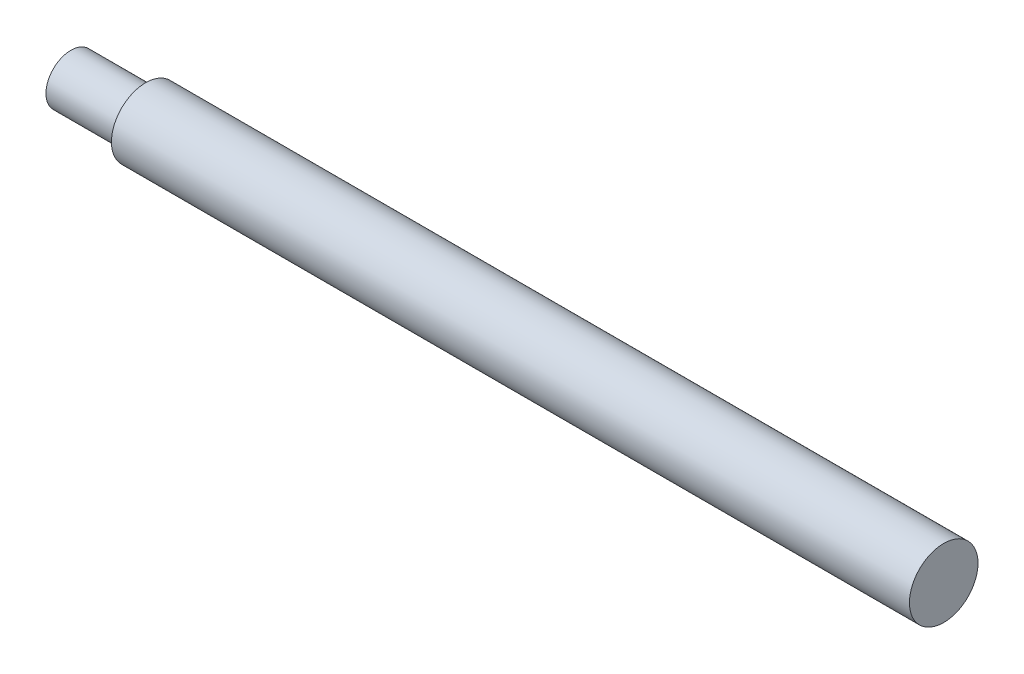
ISO-10303-21;
HEADER;
FILE_DESCRIPTION(('STEP AP214'),'2;1');
FILE_NAME('part.step','',(''),(''),'','','');
FILE_SCHEMA(('AUTOMOTIVE_DESIGN { 1 0 10303 214 1 1 1 1 }'));
ENDSEC;
DATA;
#1=APPLICATION_CONTEXT('core data for automotive mechanical design processes');
#2=APPLICATION_PROTOCOL_DEFINITION('international standard','automotive_design',2000,#1);
#3=PRODUCT_CONTEXT('',#1,'mechanical');
#4=PRODUCT('Part','Part','',(#3));
#5=PRODUCT_RELATED_PRODUCT_CATEGORY('part','',(#4));
#6=PRODUCT_DEFINITION_FORMATION('','',#4);
#7=PRODUCT_DEFINITION_CONTEXT('part definition',#1,'design');
#8=PRODUCT_DEFINITION('design','',#6,#7);
#9=PRODUCT_DEFINITION_SHAPE('','',#8);
#10=(LENGTH_UNIT() NAMED_UNIT(*) SI_UNIT(.MILLI.,.METRE.));
#11=(NAMED_UNIT(*) PLANE_ANGLE_UNIT() SI_UNIT($,.RADIAN.));
#12=(NAMED_UNIT(*) SI_UNIT($,.STERADIAN.) SOLID_ANGLE_UNIT());
#13=UNCERTAINTY_MEASURE_WITH_UNIT(LENGTH_MEASURE(1.E-05),#10,'distance_accuracy_value','');
#14=(GEOMETRIC_REPRESENTATION_CONTEXT(3) GLOBAL_UNCERTAINTY_ASSIGNED_CONTEXT((#13)) GLOBAL_UNIT_ASSIGNED_CONTEXT((#10,
#11,#12)) REPRESENTATION_CONTEXT('',''));
#15=CARTESIAN_POINT('',(0.,0.,0.));
#16=DIRECTION('',(0.,0.,1.));
#17=DIRECTION('',(1.,0.,0.));
#18=AXIS2_PLACEMENT_3D('',#15,#16,#17);
#19=CARTESIAN_POINT('',(-406.4,0.,0.));
#20=DIRECTION('',(1.,0.,0.));
#21=DIRECTION('',(0.,0.,-1.));
#22=AXIS2_PLACEMENT_3D('',#19,#20,#21);
#23=PLANE('',#22);
#24=CARTESIAN_POINT('',(-406.4,0.,0.));
#25=DIRECTION('',(1.,0.,0.));
#26=DIRECTION('',(0.,0.,-1.));
#27=AXIS2_PLACEMENT_3D('',#24,#25,#26);
#28=CIRCLE('',#27,17.4625);
#29=CARTESIAN_POINT('',(-406.4,0.,-17.4625));
#30=VERTEX_POINT('',#29);
#31=EDGE_CURVE('E37',#30,#30,#28,.T.);
#32=ORIENTED_EDGE('',*,*,#31,.F.);
#33=EDGE_LOOP('',(#32));
#34=FACE_BOUND('',#33,.T.);
#35=CARTESIAN_POINT('',(-406.4,0.,0.));
#36=DIRECTION('',(1.,0.,0.));
#37=DIRECTION('',(0.,0.,-1.));
#38=AXIS2_PLACEMENT_3D('',#35,#36,#37);
#39=CIRCLE('',#38,12.7);
#40=CARTESIAN_POINT('',(-406.4,0.,-12.7));
#41=VERTEX_POINT('',#40);
#42=EDGE_CURVE('E10',#41,#41,#39,.F.);
#43=ORIENTED_EDGE('',*,*,#42,.F.);
#44=EDGE_LOOP('',(#43));
#45=FACE_BOUND('',#44,.T.);
#46=ADVANCED_FACE('F30',(#34,#45),#23,.F.);
#47=CARTESIAN_POINT('',(-406.4,0.,0.));
#48=DIRECTION('',(1.,0.,0.));
#49=DIRECTION('',(0.,0.,-1.));
#50=AXIS2_PLACEMENT_3D('',#47,#48,#49);
#51=CYLINDRICAL_SURFACE('',#50,17.4625);
#52=ORIENTED_EDGE('',*,*,#31,.T.);
#53=EDGE_LOOP('',(#52));
#54=FACE_BOUND('',#53,.T.);
#55=CARTESIAN_POINT('',(0.,0.,0.));
#56=DIRECTION('',(1.,0.,0.));
#57=DIRECTION('',(0.,0.,-1.));
#58=AXIS2_PLACEMENT_3D('',#55,#56,#57);
#59=CIRCLE('',#58,17.4625);
#60=CARTESIAN_POINT('',(0.,0.,-17.4625));
#61=VERTEX_POINT('',#60);
#62=EDGE_CURVE('E41',#61,#61,#59,.T.);
#63=ORIENTED_EDGE('',*,*,#62,.F.);
#64=EDGE_LOOP('',(#63));
#65=FACE_BOUND('',#64,.T.);
#66=ADVANCED_FACE('F32',(#54,#65),#51,.T.);
#67=CARTESIAN_POINT('',(0.,0.,0.));
#68=DIRECTION('',(1.,0.,0.));
#69=DIRECTION('',(0.,0.,-1.));
#70=AXIS2_PLACEMENT_3D('',#67,#68,#69);
#71=PLANE('',#70);
#72=ORIENTED_EDGE('',*,*,#62,.T.);
#73=EDGE_LOOP('',(#72));
#74=FACE_BOUND('',#73,.T.);
#75=ADVANCED_FACE('F55',(#74),#71,.T.);
#76=CARTESIAN_POINT('',(-444.5,0.,0.));
#77=DIRECTION('',(1.,0.,0.));
#78=DIRECTION('',(0.,0.,-1.));
#79=AXIS2_PLACEMENT_3D('',#76,#77,#78);
#80=CYLINDRICAL_SURFACE('',#79,12.7);
#81=CARTESIAN_POINT('',(-444.5,0.,0.));
#82=DIRECTION('',(-1.,0.,0.));
#83=DIRECTION('',(0.,0.,1.));
#84=AXIS2_PLACEMENT_3D('',#81,#82,#83);
#85=CIRCLE('',#84,12.7);
#86=CARTESIAN_POINT('',(-444.5,0.,-12.7));
#87=VERTEX_POINT('',#86);
#88=EDGE_CURVE('E46',#87,#87,#85,.T.);
#89=CARTESIAN_POINT('',(-444.5,0.,-12.7));
#90=CARTESIAN_POINT('',(-444.103125,0.,-12.7));
#91=CARTESIAN_POINT('',(-443.70625,0.,-12.7));
#92=CARTESIAN_POINT('',(-442.9125,0.,-12.7));
#93=CARTESIAN_POINT('',(-442.515625,0.,-12.7));
#94=CARTESIAN_POINT('',(-441.721875,0.,-12.7));
#95=CARTESIAN_POINT('',(-441.325,0.,-12.7));
#96=CARTESIAN_POINT('',(-440.53125,0.,-12.7));
#97=CARTESIAN_POINT('',(-440.134375,0.,-12.7));
#98=CARTESIAN_POINT('',(-439.340625,0.,-12.7));
#99=CARTESIAN_POINT('',(-438.94375,0.,-12.7));
#100=CARTESIAN_POINT('',(-438.15,0.,-12.7));
#101=CARTESIAN_POINT('',(-437.753125,0.,-12.7));
#102=CARTESIAN_POINT('',(-436.959375,0.,-12.7));
#103=CARTESIAN_POINT('',(-436.5625,0.,-12.7));
#104=CARTESIAN_POINT('',(-435.76875,0.,-12.7));
#105=CARTESIAN_POINT('',(-435.371875,0.,-12.7));
#106=CARTESIAN_POINT('',(-434.578125,0.,-12.7));
#107=CARTESIAN_POINT('',(-434.18125,0.,-12.7));
#108=CARTESIAN_POINT('',(-433.3875,0.,-12.7));
#109=CARTESIAN_POINT('',(-432.990625,0.,-12.7));
#110=CARTESIAN_POINT('',(-432.196875,0.,-12.7));
#111=CARTESIAN_POINT('',(-431.8,0.,-12.7));
#112=CARTESIAN_POINT('',(-431.00625,0.,-12.7));
#113=CARTESIAN_POINT('',(-430.609375,0.,-12.7));
#114=CARTESIAN_POINT('',(-429.815625,0.,-12.7));
#115=CARTESIAN_POINT('',(-429.41875,0.,-12.7));
#116=CARTESIAN_POINT('',(-428.625,0.,-12.7));
#117=CARTESIAN_POINT('',(-428.228125,0.,-12.7));
#118=CARTESIAN_POINT('',(-427.434375,0.,-12.7));
#119=CARTESIAN_POINT('',(-427.0375,0.,-12.7));
#120=CARTESIAN_POINT('',(-426.24375,0.,-12.7));
#121=CARTESIAN_POINT('',(-425.846875,0.,-12.7));
#122=CARTESIAN_POINT('',(-425.053125,0.,-12.7));
#123=CARTESIAN_POINT('',(-424.65625,0.,-12.7));
#124=CARTESIAN_POINT('',(-423.8625,0.,-12.7));
#125=CARTESIAN_POINT('',(-423.465625,0.,-12.7));
#126=CARTESIAN_POINT('',(-422.671875,0.,-12.7));
#127=CARTESIAN_POINT('',(-422.275,0.,-12.7));
#128=CARTESIAN_POINT('',(-421.48125,0.,-12.7));
#129=CARTESIAN_POINT('',(-421.084375,0.,-12.7));
#130=CARTESIAN_POINT('',(-420.290625,0.,-12.7));
#131=CARTESIAN_POINT('',(-419.89375,0.,-12.7));
#132=CARTESIAN_POINT('',(-419.1,0.,-12.7));
#133=CARTESIAN_POINT('',(-418.703125,0.,-12.7));
#134=CARTESIAN_POINT('',(-417.909375,0.,-12.7));
#135=CARTESIAN_POINT('',(-417.5125,0.,-12.7));
#136=CARTESIAN_POINT('',(-416.71875,0.,-12.7));
#137=CARTESIAN_POINT('',(-416.321875,0.,-12.7));
#138=CARTESIAN_POINT('',(-415.528125,0.,-12.7));
#139=CARTESIAN_POINT('',(-415.13125,0.,-12.7));
#140=CARTESIAN_POINT('',(-414.3375,0.,-12.7));
#141=CARTESIAN_POINT('',(-413.940625,0.,-12.7));
#142=CARTESIAN_POINT('',(-413.146875,0.,-12.7));
#143=CARTESIAN_POINT('',(-412.75,0.,-12.7));
#144=CARTESIAN_POINT('',(-411.95625,0.,-12.7));
#145=CARTESIAN_POINT('',(-411.559375,0.,-12.7));
#146=CARTESIAN_POINT('',(-410.765625,0.,-12.7));
#147=CARTESIAN_POINT('',(-410.36875,0.,-12.7));
#148=CARTESIAN_POINT('',(-409.575,0.,-12.7));
#149=CARTESIAN_POINT('',(-409.178125,0.,-12.7));
#150=CARTESIAN_POINT('',(-408.384375,0.,-12.7));
#151=CARTESIAN_POINT('',(-407.9875,0.,-12.7));
#152=CARTESIAN_POINT('',(-407.19375,0.,-12.7));
#153=CARTESIAN_POINT('',(-406.796875,0.,-12.7));
#154=CARTESIAN_POINT('',(-406.4,0.,-12.7));
#155=B_SPLINE_CURVE_WITH_KNOTS('',3,(#89,#90,#91,#92,#93,#94,#95,#96,#97,#98,#99,#100,#101,#102,
#103,#104,#105,#106,#107,#108,#109,#110,#111,#112,#113,#114,#115,#116,#117,#118,#119,#120,#121,
#122,#123,#124,#125,#126,#127,#128,#129,#130,#131,#132,#133,#134,#135,#136,#137,#138,#139,#140,
#141,#142,#143,#144,#145,#146,#147,#148,#149,#150,#151,#152,#153,#154),.UNSPECIFIED.,.F.,.F.,(4,
2,2,2,2,2,2,2,2,2,2,2,2,2,2,2,2,2,2,2,2,2,2,2,2,2,2,2,2,2,2,2,4),(0.,1.19062499999995,
2.38124999999995,3.57187499999995,4.76249999999995,5.95312499999995,7.14374999999995,
8.33437499999995,9.52499999999995,10.715625,11.90625,13.096875,14.2875,15.478125,16.66875,
17.859375,19.05,20.240625,21.43125,22.621875,23.8125,25.003125,26.19375,27.384375,28.575,
29.765625,30.95625,32.146875,33.3375,34.528125,35.7187499999999,36.9093749999999,
38.0999999999999),.UNSPECIFIED.);
#156=EDGE_CURVE('BSEAM53',#87,#41,#155,.T.);
#157=ORIENTED_EDGE('',*,*,#88,.F.);
#158=ORIENTED_EDGE('',*,*,#42,.T.);
#159=ORIENTED_EDGE('',*,*,#156,.T.);
#160=ORIENTED_EDGE('',*,*,#156,.F.);
#161=EDGE_LOOP('',(#157,#159,#158,#160));
#162=FACE_BOUND('',#161,.T.);
#163=ADVANCED_FACE('F53',(#162),#80,.T.);
#164=CARTESIAN_POINT('',(-444.5,0.,0.));
#165=DIRECTION('',(-1.,0.,0.));
#166=DIRECTION('',(0.,0.,1.));
#167=AXIS2_PLACEMENT_3D('',#164,#165,#166);
#168=PLANE('',#167);
#169=ORIENTED_EDGE('',*,*,#88,.T.);
#170=EDGE_LOOP('',(#169));
#171=FACE_BOUND('',#170,.T.);
#172=ADVANCED_FACE('F51',(#171),#168,.T.);
#173=CLOSED_SHELL('',(#46,#66,#75,#163,#172));
#174=MANIFOLD_SOLID_BREP('B2',#173);
#175=ADVANCED_BREP_SHAPE_REPRESENTATION('',(#18,#174),#14);
#176=SHAPE_DEFINITION_REPRESENTATION(#9,#175);
ENDSEC;
END-ISO-10303-21;
